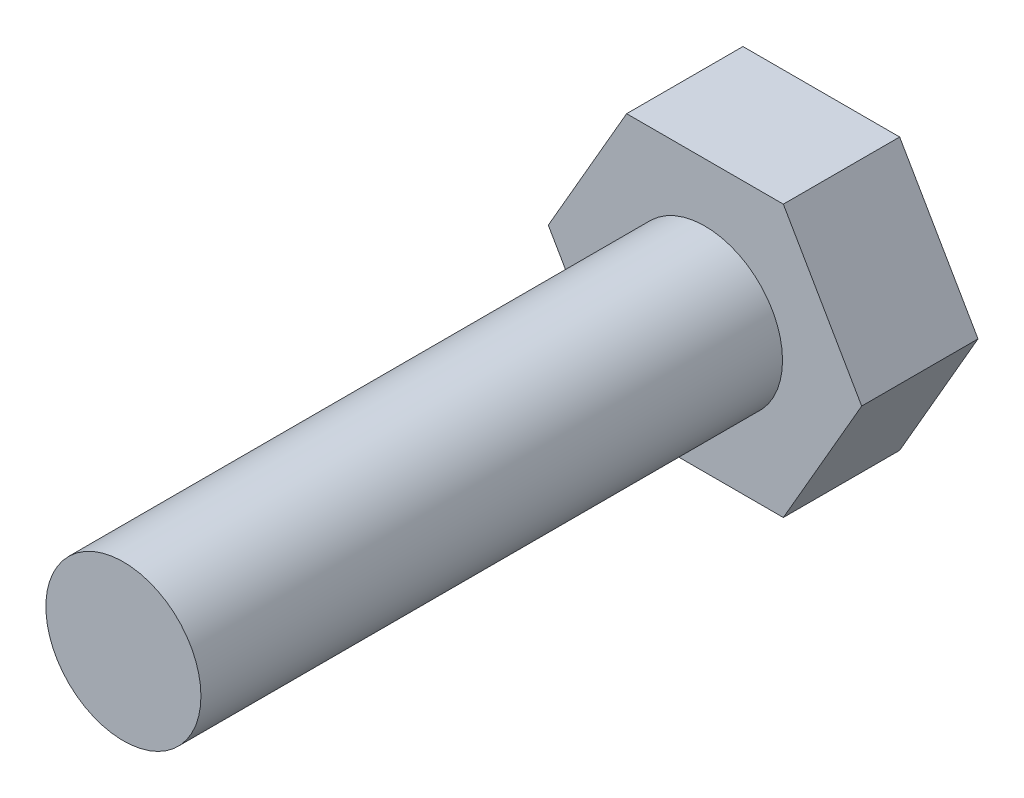
ISO-10303-21;
HEADER;
FILE_DESCRIPTION(('STEP AP214'),'2;1');
FILE_NAME('part.step','',(''),(''),'','','');
FILE_SCHEMA(('AUTOMOTIVE_DESIGN { 1 0 10303 214 1 1 1 1 }'));
ENDSEC;
DATA;
#1=APPLICATION_CONTEXT('core data for automotive mechanical design processes');
#2=APPLICATION_PROTOCOL_DEFINITION('international standard','automotive_design',2000,#1);
#3=PRODUCT_CONTEXT('',#1,'mechanical');
#4=PRODUCT('Part','Part','',(#3));
#5=PRODUCT_RELATED_PRODUCT_CATEGORY('part','',(#4));
#6=PRODUCT_DEFINITION_FORMATION('','',#4);
#7=PRODUCT_DEFINITION_CONTEXT('part definition',#1,'design');
#8=PRODUCT_DEFINITION('design','',#6,#7);
#9=PRODUCT_DEFINITION_SHAPE('','',#8);
#10=(LENGTH_UNIT() NAMED_UNIT(*) SI_UNIT(.MILLI.,.METRE.));
#11=(NAMED_UNIT(*) PLANE_ANGLE_UNIT() SI_UNIT($,.RADIAN.));
#12=(NAMED_UNIT(*) SI_UNIT($,.STERADIAN.) SOLID_ANGLE_UNIT());
#13=UNCERTAINTY_MEASURE_WITH_UNIT(LENGTH_MEASURE(1.E-05),#10,'distance_accuracy_value','');
#14=(GEOMETRIC_REPRESENTATION_CONTEXT(3) GLOBAL_UNCERTAINTY_ASSIGNED_CONTEXT((#13)) GLOBAL_UNIT_ASSIGNED_CONTEXT((#10,
#11,#12)) REPRESENTATION_CONTEXT('',''));
#15=CARTESIAN_POINT('',(0.,0.,0.));
#16=DIRECTION('',(0.,0.,1.));
#17=DIRECTION('',(1.,0.,0.));
#18=AXIS2_PLACEMENT_3D('',#15,#16,#17);
#19=CARTESIAN_POINT('',(4.04145188432737,0.,3.));
#20=DIRECTION('',(-0.866025403784438,-0.500000000000001,0.));
#21=DIRECTION('',(0.500000000000001,-0.866025403784438,0.));
#22=AXIS2_PLACEMENT_3D('',#19,#20,#21);
#23=PLANE('',#22);
#24=DIRECTION('',(-0.500000000000001,0.866025403784438,0.));
#25=VECTOR('',#24,1.);
#26=CARTESIAN_POINT('',(4.04145188432737,0.,0.));
#27=LINE('',#26,#25);
#28=CARTESIAN_POINT('',(4.04145188432737,0.,0.));
#29=VERTEX_POINT('',#28);
#30=CARTESIAN_POINT('',(2.02072594216368,3.49999999999999,0.));
#31=VERTEX_POINT('',#30);
#32=EDGE_CURVE('E123',#29,#31,#27,.T.);
#33=ORIENTED_EDGE('',*,*,#32,.T.);
#34=DIRECTION('',(0.,0.,-1.));
#35=VECTOR('',#34,1.);
#36=CARTESIAN_POINT('',(2.02072594216368,3.49999999999999,3.));
#37=LINE('',#36,#35);
#38=CARTESIAN_POINT('',(2.02072594216368,3.49999999999999,3.));
#39=VERTEX_POINT('',#38);
#40=EDGE_CURVE('E40',#39,#31,#37,.T.);
#41=ORIENTED_EDGE('',*,*,#40,.F.);
#42=DIRECTION('',(-0.500000000000001,0.866025403784438,0.));
#43=VECTOR('',#42,1.);
#44=CARTESIAN_POINT('',(4.04145188432737,0.,3.));
#45=LINE('',#44,#43);
#46=CARTESIAN_POINT('',(4.04145188432737,0.,3.));
#47=VERTEX_POINT('',#46);
#48=EDGE_CURVE('E134',#47,#39,#45,.T.);
#49=ORIENTED_EDGE('',*,*,#48,.F.);
#50=DIRECTION('',(0.,0.,-1.));
#51=VECTOR('',#50,1.);
#52=CARTESIAN_POINT('',(4.04145188432737,0.,3.));
#53=LINE('',#52,#51);
#54=EDGE_CURVE('E119',#47,#29,#53,.T.);
#55=ORIENTED_EDGE('',*,*,#54,.T.);
#56=EDGE_LOOP('',(#33,#41,#49,#55));
#57=FACE_BOUND('',#56,.T.);
#58=ADVANCED_FACE('F37',(#57),#23,.F.);
#59=CARTESIAN_POINT('',(2.02072594216368,3.49999999999999,3.));
#60=DIRECTION('',(0.,-1.,0.));
#61=DIRECTION('',(1.,0.,0.));
#62=AXIS2_PLACEMENT_3D('',#59,#60,#61);
#63=PLANE('',#62);
#64=DIRECTION('',(-1.,0.,0.));
#65=VECTOR('',#64,1.);
#66=CARTESIAN_POINT('',(2.02072594216368,3.49999999999999,0.));
#67=LINE('',#66,#65);
#68=CARTESIAN_POINT('',(-2.0207259421637,3.49999999999998,0.));
#69=VERTEX_POINT('',#68);
#70=EDGE_CURVE('E126',#31,#69,#67,.T.);
#71=ORIENTED_EDGE('',*,*,#70,.T.);
#72=DIRECTION('',(0.,0.,-1.));
#73=VECTOR('',#72,1.);
#74=CARTESIAN_POINT('',(-2.0207259421637,3.49999999999998,3.));
#75=LINE('',#74,#73);
#76=CARTESIAN_POINT('',(-2.0207259421637,3.49999999999998,3.));
#77=VERTEX_POINT('',#76);
#78=EDGE_CURVE('E137',#77,#69,#75,.T.);
#79=ORIENTED_EDGE('',*,*,#78,.F.);
#80=DIRECTION('',(-1.,0.,0.));
#81=VECTOR('',#80,1.);
#82=CARTESIAN_POINT('',(2.02072594216368,3.49999999999999,3.));
#83=LINE('',#82,#81);
#84=EDGE_CURVE('E92',#39,#77,#83,.T.);
#85=ORIENTED_EDGE('',*,*,#84,.F.);
#86=ORIENTED_EDGE('',*,*,#40,.T.);
#87=EDGE_LOOP('',(#71,#79,#85,#86));
#88=FACE_BOUND('',#87,.T.);
#89=ADVANCED_FACE('F142',(#88),#63,.F.);
#90=CARTESIAN_POINT('',(-2.0207259421637,3.49999999999998,3.));
#91=DIRECTION('',(0.866025403784441,-0.499999999999995,0.));
#92=DIRECTION('',(0.499999999999995,0.866025403784442,0.));
#93=AXIS2_PLACEMENT_3D('',#90,#91,#92);
#94=PLANE('',#93);
#95=DIRECTION('',(-0.499999999999995,-0.866025403784442,0.));
#96=VECTOR('',#95,1.);
#97=CARTESIAN_POINT('',(-2.0207259421637,3.49999999999998,0.));
#98=LINE('',#97,#96);
#99=CARTESIAN_POINT('',(-4.04145188432737,0.,0.));
#100=VERTEX_POINT('',#99);
#101=EDGE_CURVE('E129',#69,#100,#98,.T.);
#102=ORIENTED_EDGE('',*,*,#101,.T.);
#103=DIRECTION('',(0.,0.,-1.));
#104=VECTOR('',#103,1.);
#105=CARTESIAN_POINT('',(-4.04145188432737,0.,3.));
#106=LINE('',#105,#104);
#107=CARTESIAN_POINT('',(-4.04145188432737,0.,3.));
#108=VERTEX_POINT('',#107);
#109=EDGE_CURVE('E114',#108,#100,#106,.T.);
#110=ORIENTED_EDGE('',*,*,#109,.F.);
#111=DIRECTION('',(-0.499999999999995,-0.866025403784442,0.));
#112=VECTOR('',#111,1.);
#113=CARTESIAN_POINT('',(-2.0207259421637,3.49999999999998,3.));
#114=LINE('',#113,#112);
#115=EDGE_CURVE('E105',#77,#108,#114,.T.);
#116=ORIENTED_EDGE('',*,*,#115,.F.);
#117=ORIENTED_EDGE('',*,*,#78,.T.);
#118=EDGE_LOOP('',(#102,#110,#116,#117));
#119=FACE_BOUND('',#118,.T.);
#120=ADVANCED_FACE('F148',(#119),#94,.F.);
#121=CARTESIAN_POINT('',(-4.04145188432737,0.,3.));
#122=DIRECTION('',(0.866025403784435,0.500000000000007,0.));
#123=DIRECTION('',(-0.500000000000007,0.866025403784434,0.));
#124=AXIS2_PLACEMENT_3D('',#121,#122,#123);
#125=PLANE('',#124);
#126=DIRECTION('',(0.500000000000007,-0.866025403784435,0.));
#127=VECTOR('',#126,1.);
#128=CARTESIAN_POINT('',(-4.04145188432737,0.,0.));
#129=LINE('',#128,#127);
#130=CARTESIAN_POINT('',(-2.02072594216365,-3.50000000000001,0.));
#131=VERTEX_POINT('',#130);
#132=EDGE_CURVE('E113',#100,#131,#129,.T.);
#133=ORIENTED_EDGE('',*,*,#132,.T.);
#134=DIRECTION('',(0.,0.,-1.));
#135=VECTOR('',#134,1.);
#136=CARTESIAN_POINT('',(-2.02072594216365,-3.50000000000001,3.));
#137=LINE('',#136,#135);
#138=CARTESIAN_POINT('',(-2.02072594216365,-3.50000000000001,3.));
#139=VERTEX_POINT('',#138);
#140=EDGE_CURVE('E110',#139,#131,#137,.T.);
#141=ORIENTED_EDGE('',*,*,#140,.F.);
#142=DIRECTION('',(0.500000000000007,-0.866025403784435,0.));
#143=VECTOR('',#142,1.);
#144=CARTESIAN_POINT('',(-4.04145188432737,0.,3.));
#145=LINE('',#144,#143);
#146=EDGE_CURVE('E99',#108,#139,#145,.T.);
#147=ORIENTED_EDGE('',*,*,#146,.F.);
#148=ORIENTED_EDGE('',*,*,#109,.T.);
#149=EDGE_LOOP('',(#133,#141,#147,#148));
#150=FACE_BOUND('',#149,.T.);
#151=ADVANCED_FACE('F111',(#150),#125,.F.);
#152=CARTESIAN_POINT('',(-2.02072594216365,-3.50000000000001,3.));
#153=DIRECTION('',(0.,1.,0.));
#154=DIRECTION('',(-1.,0.,0.));
#155=AXIS2_PLACEMENT_3D('',#152,#153,#154);
#156=PLANE('',#155);
#157=DIRECTION('',(1.,0.,0.));
#158=VECTOR('',#157,1.);
#159=CARTESIAN_POINT('',(-2.02072594216365,-3.50000000000001,0.));
#160=LINE('',#159,#158);
#161=CARTESIAN_POINT('',(2.02072594216372,-3.49999999999996,0.));
#162=VERTEX_POINT('',#161);
#163=EDGE_CURVE('E77',#131,#162,#160,.T.);
#164=ORIENTED_EDGE('',*,*,#163,.T.);
#165=DIRECTION('',(0.,0.,-1.));
#166=VECTOR('',#165,1.);
#167=CARTESIAN_POINT('',(2.02072594216372,-3.49999999999996,3.));
#168=LINE('',#167,#166);
#169=CARTESIAN_POINT('',(2.02072594216372,-3.49999999999996,3.));
#170=VERTEX_POINT('',#169);
#171=EDGE_CURVE('E115',#170,#162,#168,.T.);
#172=ORIENTED_EDGE('',*,*,#171,.F.);
#173=DIRECTION('',(1.,0.,0.));
#174=VECTOR('',#173,1.);
#175=CARTESIAN_POINT('',(-2.02072594216365,-3.50000000000001,3.));
#176=LINE('',#175,#174);
#177=EDGE_CURVE('E103',#139,#170,#176,.T.);
#178=ORIENTED_EDGE('',*,*,#177,.F.);
#179=ORIENTED_EDGE('',*,*,#140,.T.);
#180=EDGE_LOOP('',(#164,#172,#178,#179));
#181=FACE_BOUND('',#180,.T.);
#182=ADVANCED_FACE('F117',(#181),#156,.F.);
#183=CARTESIAN_POINT('',(2.02072594216372,-3.49999999999996,3.));
#184=DIRECTION('',(-0.866025403784441,0.499999999999995,0.));
#185=DIRECTION('',(-0.499999999999995,-0.866025403784442,0.));
#186=AXIS2_PLACEMENT_3D('',#183,#184,#185);
#187=PLANE('',#186);
#188=DIRECTION('',(0.499999999999995,0.866025403784442,0.));
#189=VECTOR('',#188,1.);
#190=CARTESIAN_POINT('',(2.02072594216372,-3.49999999999996,0.));
#191=LINE('',#190,#189);
#192=EDGE_CURVE('E83',#162,#29,#191,.T.);
#193=ORIENTED_EDGE('',*,*,#192,.T.);
#194=ORIENTED_EDGE('',*,*,#54,.F.);
#195=DIRECTION('',(0.499999999999995,0.866025403784442,0.));
#196=VECTOR('',#195,1.);
#197=CARTESIAN_POINT('',(2.02072594216372,-3.49999999999996,3.));
#198=LINE('',#197,#196);
#199=EDGE_CURVE('E54',#170,#47,#198,.T.);
#200=ORIENTED_EDGE('',*,*,#199,.F.);
#201=ORIENTED_EDGE('',*,*,#171,.T.);
#202=EDGE_LOOP('',(#193,#194,#200,#201));
#203=FACE_BOUND('',#202,.T.);
#204=ADVANCED_FACE('F164',(#203),#187,.F.);
#205=CARTESIAN_POINT('',(0.,0.,3.));
#206=DIRECTION('',(0.,0.,1.));
#207=DIRECTION('',(1.,0.,0.));
#208=AXIS2_PLACEMENT_3D('',#205,#206,#207);
#209=PLANE('',#208);
#210=CARTESIAN_POINT('',(0.,0.,3.));
#211=DIRECTION('',(0.,0.,1.));
#212=DIRECTION('',(1.,0.,0.));
#213=AXIS2_PLACEMENT_3D('',#210,#211,#212);
#214=CIRCLE('',#213,2.);
#215=CARTESIAN_POINT('',(2.,0.,3.));
#216=VERTEX_POINT('',#215);
#217=EDGE_CURVE('E11',#216,#216,#214,.T.);
#218=ORIENTED_EDGE('',*,*,#217,.F.);
#219=EDGE_LOOP('',(#218));
#220=FACE_BOUND('',#219,.T.);
#221=ORIENTED_EDGE('',*,*,#48,.T.);
#222=ORIENTED_EDGE('',*,*,#84,.T.);
#223=ORIENTED_EDGE('',*,*,#115,.T.);
#224=ORIENTED_EDGE('',*,*,#146,.T.);
#225=ORIENTED_EDGE('',*,*,#177,.T.);
#226=ORIENTED_EDGE('',*,*,#199,.T.);
#227=EDGE_LOOP('',(#221,#222,#223,#224,#225,#226));
#228=FACE_BOUND('',#227,.T.);
#229=ADVANCED_FACE('F101',(#220,#228),#209,.T.);
#230=CARTESIAN_POINT('',(0.,0.,0.));
#231=DIRECTION('',(0.,0.,1.));
#232=DIRECTION('',(1.,0.,0.));
#233=AXIS2_PLACEMENT_3D('',#230,#231,#232);
#234=PLANE('',#233);
#235=ORIENTED_EDGE('',*,*,#32,.F.);
#236=ORIENTED_EDGE('',*,*,#192,.F.);
#237=ORIENTED_EDGE('',*,*,#163,.F.);
#238=ORIENTED_EDGE('',*,*,#132,.F.);
#239=ORIENTED_EDGE('',*,*,#101,.F.);
#240=ORIENTED_EDGE('',*,*,#70,.F.);
#241=EDGE_LOOP('',(#235,#236,#237,#238,#239,#240));
#242=FACE_BOUND('',#241,.T.);
#243=ADVANCED_FACE('F147',(#242),#234,.F.);
#244=CARTESIAN_POINT('',(0.,0.,18.));
#245=DIRECTION('',(0.,0.,-1.));
#246=DIRECTION('',(-1.,0.,0.));
#247=AXIS2_PLACEMENT_3D('',#244,#245,#246);
#248=CYLINDRICAL_SURFACE('',#247,2.);
#249=CARTESIAN_POINT('',(0.,0.,18.));
#250=DIRECTION('',(0.,0.,1.));
#251=DIRECTION('',(1.,0.,0.));
#252=AXIS2_PLACEMENT_3D('',#249,#250,#251);
#253=CIRCLE('',#252,2.);
#254=CARTESIAN_POINT('',(2.,0.,18.));
#255=VERTEX_POINT('',#254);
#256=EDGE_CURVE('E127',#255,#255,#253,.T.);
#257=ORIENTED_EDGE('',*,*,#256,.F.);
#258=EDGE_LOOP('',(#257));
#259=FACE_BOUND('',#258,.T.);
#260=ORIENTED_EDGE('',*,*,#217,.T.);
#261=EDGE_LOOP('',(#260));
#262=FACE_BOUND('',#261,.T.);
#263=ADVANCED_FACE('F157',(#259,#262),#248,.T.);
#264=CARTESIAN_POINT('',(0.,0.,18.));
#265=DIRECTION('',(0.,0.,1.));
#266=DIRECTION('',(1.,0.,0.));
#267=AXIS2_PLACEMENT_3D('',#264,#265,#266);
#268=PLANE('',#267);
#269=ORIENTED_EDGE('',*,*,#256,.T.);
#270=EDGE_LOOP('',(#269));
#271=FACE_BOUND('',#270,.T.);
#272=ADVANCED_FACE('F155',(#271),#268,.T.);
#273=CLOSED_SHELL('',(#58,#89,#120,#151,#182,#204,#229,#243,#263,#272));
#274=MANIFOLD_SOLID_BREP('B2',#273);
#275=ADVANCED_BREP_SHAPE_REPRESENTATION('',(#18,#274),#14);
#276=SHAPE_DEFINITION_REPRESENTATION(#9,#275);
ENDSEC;
END-ISO-10303-21;
